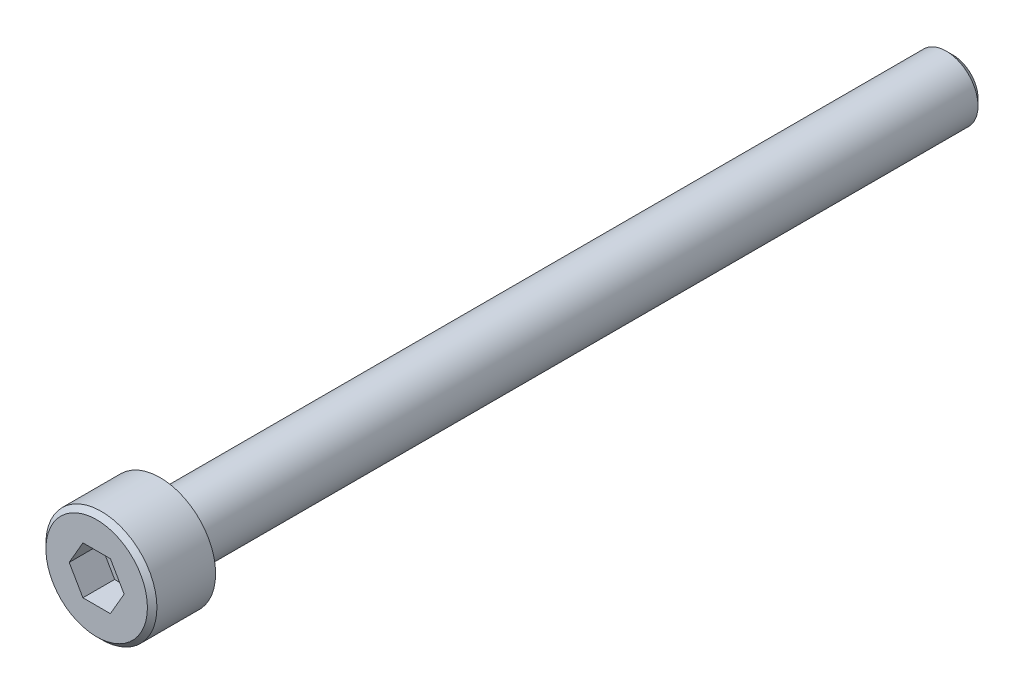
ISO-10303-21;
HEADER;
FILE_DESCRIPTION(('STEP AP214'),'2;1');
FILE_NAME('part.step','',(''),(''),'','','');
FILE_SCHEMA(('AUTOMOTIVE_DESIGN { 1 0 10303 214 1 1 1 1 }'));
ENDSEC;
DATA;
#1=APPLICATION_CONTEXT('core data for automotive mechanical design processes');
#2=APPLICATION_PROTOCOL_DEFINITION('international standard','automotive_design',2000,#1);
#3=PRODUCT_CONTEXT('',#1,'mechanical');
#4=PRODUCT('Part','Part','',(#3));
#5=PRODUCT_RELATED_PRODUCT_CATEGORY('part','',(#4));
#6=PRODUCT_DEFINITION_FORMATION('','',#4);
#7=PRODUCT_DEFINITION_CONTEXT('part definition',#1,'design');
#8=PRODUCT_DEFINITION('design','',#6,#7);
#9=PRODUCT_DEFINITION_SHAPE('','',#8);
#10=(LENGTH_UNIT() NAMED_UNIT(*) SI_UNIT(.MILLI.,.METRE.));
#11=(NAMED_UNIT(*) PLANE_ANGLE_UNIT() SI_UNIT($,.RADIAN.));
#12=(NAMED_UNIT(*) SI_UNIT($,.STERADIAN.) SOLID_ANGLE_UNIT());
#13=UNCERTAINTY_MEASURE_WITH_UNIT(LENGTH_MEASURE(1.E-05),#10,'distance_accuracy_value','');
#14=(GEOMETRIC_REPRESENTATION_CONTEXT(3) GLOBAL_UNCERTAINTY_ASSIGNED_CONTEXT((#13)) GLOBAL_UNIT_ASSIGNED_CONTEXT((#10,
#11,#12)) REPRESENTATION_CONTEXT('',''));
#15=CARTESIAN_POINT('',(0.,0.,0.));
#16=DIRECTION('',(0.,0.,1.));
#17=DIRECTION('',(1.,0.,0.));
#18=AXIS2_PLACEMENT_3D('',#15,#16,#17);
#19=CARTESIAN_POINT('',(0.,0.,4.));
#20=DIRECTION('',(0.,0.,-1.));
#21=DIRECTION('',(-1.,0.,0.));
#22=AXIS2_PLACEMENT_3D('',#19,#20,#21);
#23=PLANE('',#22);
#24=DIRECTION('',(1.,0.,0.));
#25=VECTOR('',#24,1.);
#26=CARTESIAN_POINT('',(-0.866025403784439,-1.5,4.));
#27=LINE('',#26,#25);
#28=CARTESIAN_POINT('',(-0.866025403784439,-1.5,4.));
#29=VERTEX_POINT('',#28);
#30=CARTESIAN_POINT('',(0.866025403784439,-1.5,4.));
#31=VERTEX_POINT('',#30);
#32=EDGE_CURVE('E125',#29,#31,#27,.T.);
#33=ORIENTED_EDGE('',*,*,#32,.F.);
#34=DIRECTION('',(0.5,-0.866025403784439,0.));
#35=VECTOR('',#34,1.);
#36=CARTESIAN_POINT('',(-1.73205080756888,0.,4.));
#37=LINE('',#36,#35);
#38=CARTESIAN_POINT('',(-1.73205080756888,0.,4.));
#39=VERTEX_POINT('',#38);
#40=EDGE_CURVE('E51',#39,#29,#37,.T.);
#41=ORIENTED_EDGE('',*,*,#40,.F.);
#42=DIRECTION('',(-0.5,-0.866025403784439,0.));
#43=VECTOR('',#42,1.);
#44=CARTESIAN_POINT('',(-0.866025403784439,1.5,4.));
#45=LINE('',#44,#43);
#46=CARTESIAN_POINT('',(-0.866025403784439,1.5,4.));
#47=VERTEX_POINT('',#46);
#48=EDGE_CURVE('E134',#47,#39,#45,.T.);
#49=ORIENTED_EDGE('',*,*,#48,.F.);
#50=DIRECTION('',(-1.,0.,0.));
#51=VECTOR('',#50,1.);
#52=CARTESIAN_POINT('',(0.866025403784439,1.5,4.));
#53=LINE('',#52,#51);
#54=CARTESIAN_POINT('',(0.866025403784439,1.5,4.));
#55=VERTEX_POINT('',#54);
#56=EDGE_CURVE('E132',#55,#47,#53,.T.);
#57=ORIENTED_EDGE('',*,*,#56,.F.);
#58=DIRECTION('',(-0.5,0.866025403784439,0.));
#59=VECTOR('',#58,1.);
#60=CARTESIAN_POINT('',(1.73205080756888,0.,4.));
#61=LINE('',#60,#59);
#62=CARTESIAN_POINT('',(1.73205080756888,0.,4.));
#63=VERTEX_POINT('',#62);
#64=EDGE_CURVE('E99',#63,#55,#61,.T.);
#65=ORIENTED_EDGE('',*,*,#64,.F.);
#66=DIRECTION('',(0.5,0.866025403784439,0.));
#67=VECTOR('',#66,1.);
#68=CARTESIAN_POINT('',(0.866025403784439,-1.5,4.));
#69=LINE('',#68,#67);
#70=EDGE_CURVE('E128',#31,#63,#69,.T.);
#71=ORIENTED_EDGE('',*,*,#70,.F.);
#72=EDGE_LOOP('',(#33,#41,#49,#57,#65,#71));
#73=FACE_BOUND('',#72,.T.);
#74=CARTESIAN_POINT('',(0.,0.,4.));
#75=DIRECTION('',(0.,0.,1.));
#76=DIRECTION('',(1.,0.,0.));
#77=AXIS2_PLACEMENT_3D('',#74,#75,#76);
#78=CIRCLE('',#77,3.2);
#79=CARTESIAN_POINT('',(3.2,0.,4.));
#80=VERTEX_POINT('',#79);
#81=EDGE_CURVE('E11',#80,#80,#78,.T.);
#82=ORIENTED_EDGE('',*,*,#81,.T.);
#83=EDGE_LOOP('',(#82));
#84=FACE_BOUND('',#83,.T.);
#85=ADVANCED_FACE('F37',(#73,#84),#23,.F.);
#86=CARTESIAN_POINT('',(0.,0.,3.7));
#87=DIRECTION('',(0.,0.,-1.));
#88=DIRECTION('',(-1.,0.,0.));
#89=AXIS2_PLACEMENT_3D('',#86,#87,#88);
#90=CONICAL_SURFACE('',#89,3.5,0.785398163397445);
#91=ORIENTED_EDGE('',*,*,#81,.F.);
#92=EDGE_LOOP('',(#91));
#93=FACE_BOUND('',#92,.T.);
#94=CARTESIAN_POINT('',(0.,0.,3.7));
#95=DIRECTION('',(0.,0.,1.));
#96=DIRECTION('',(1.,0.,0.));
#97=AXIS2_PLACEMENT_3D('',#94,#95,#96);
#98=CIRCLE('',#97,3.5);
#99=CARTESIAN_POINT('',(3.5,0.,3.7));
#100=VERTEX_POINT('',#99);
#101=EDGE_CURVE('E44',#100,#100,#98,.T.);
#102=ORIENTED_EDGE('',*,*,#101,.T.);
#103=EDGE_LOOP('',(#102));
#104=FACE_BOUND('',#103,.T.);
#105=ADVANCED_FACE('F157',(#93,#104),#90,.T.);
#106=CARTESIAN_POINT('',(0.,0.,-50.));
#107=DIRECTION('',(0.,0.,1.));
#108=DIRECTION('',(1.,0.,0.));
#109=AXIS2_PLACEMENT_3D('',#106,#107,#108);
#110=CYLINDRICAL_SURFACE('',#109,3.5);
#111=ORIENTED_EDGE('',*,*,#101,.F.);
#112=EDGE_LOOP('',(#111));
#113=FACE_BOUND('',#112,.T.);
#114=CARTESIAN_POINT('',(0.,0.,0.));
#115=DIRECTION('',(0.,0.,1.));
#116=DIRECTION('',(1.,0.,0.));
#117=AXIS2_PLACEMENT_3D('',#114,#115,#116);
#118=CIRCLE('',#117,3.5);
#119=CARTESIAN_POINT('',(3.5,0.,0.));
#120=VERTEX_POINT('',#119);
#121=EDGE_CURVE('E152',#120,#120,#118,.T.);
#122=ORIENTED_EDGE('',*,*,#121,.T.);
#123=EDGE_LOOP('',(#122));
#124=FACE_BOUND('',#123,.T.);
#125=ADVANCED_FACE('F159',(#113,#124),#110,.T.);
#126=CARTESIAN_POINT('',(0.,3.5,0.));
#127=DIRECTION('',(0.,0.,1.));
#128=DIRECTION('',(1.,0.,0.));
#129=AXIS2_PLACEMENT_3D('',#126,#127,#128);
#130=PLANE('',#129);
#131=ORIENTED_EDGE('',*,*,#121,.F.);
#132=EDGE_LOOP('',(#131));
#133=FACE_BOUND('',#132,.T.);
#134=CARTESIAN_POINT('',(0.,0.,0.));
#135=DIRECTION('',(0.,0.,1.));
#136=DIRECTION('',(1.,0.,0.));
#137=AXIS2_PLACEMENT_3D('',#134,#135,#136);
#138=CIRCLE('',#137,2.);
#139=CARTESIAN_POINT('',(2.,0.,0.));
#140=VERTEX_POINT('',#139);
#141=EDGE_CURVE('E149',#140,#140,#138,.T.);
#142=ORIENTED_EDGE('',*,*,#141,.T.);
#143=EDGE_LOOP('',(#142));
#144=FACE_BOUND('',#143,.T.);
#145=ADVANCED_FACE('F162',(#133,#144),#130,.F.);
#146=CARTESIAN_POINT('',(0.,0.,-50.));
#147=DIRECTION('',(0.,0.,1.));
#148=DIRECTION('',(1.,0.,0.));
#149=AXIS2_PLACEMENT_3D('',#146,#147,#148);
#150=CYLINDRICAL_SURFACE('',#149,2.);
#151=ORIENTED_EDGE('',*,*,#141,.F.);
#152=EDGE_LOOP('',(#151));
#153=FACE_BOUND('',#152,.T.);
#154=CARTESIAN_POINT('',(0.,0.,-49.5705));
#155=DIRECTION('',(0.,0.,1.));
#156=DIRECTION('',(1.,0.,0.));
#157=AXIS2_PLACEMENT_3D('',#154,#155,#156);
#158=CIRCLE('',#157,2.);
#159=CARTESIAN_POINT('',(2.,0.,-49.5705));
#160=VERTEX_POINT('',#159);
#161=EDGE_CURVE('E146',#160,#160,#158,.T.);
#162=ORIENTED_EDGE('',*,*,#161,.T.);
#163=EDGE_LOOP('',(#162));
#164=FACE_BOUND('',#163,.T.);
#165=ADVANCED_FACE('F168',(#153,#164),#150,.T.);
#166=CARTESIAN_POINT('',(0.,0.,-50.));
#167=DIRECTION('',(0.,0.,1.));
#168=DIRECTION('',(1.,0.,0.));
#169=AXIS2_PLACEMENT_3D('',#166,#167,#168);
#170=CONICAL_SURFACE('',#169,1.5705,0.785398163397449);
#171=ORIENTED_EDGE('',*,*,#161,.F.);
#172=EDGE_LOOP('',(#171));
#173=FACE_BOUND('',#172,.T.);
#174=CARTESIAN_POINT('',(0.,0.,-50.));
#175=DIRECTION('',(0.,0.,1.));
#176=DIRECTION('',(1.,0.,0.));
#177=AXIS2_PLACEMENT_3D('',#174,#175,#176);
#178=CIRCLE('',#177,1.5705);
#179=CARTESIAN_POINT('',(1.5705,0.,-50.));
#180=VERTEX_POINT('',#179);
#181=EDGE_CURVE('E138',#180,#180,#178,.T.);
#182=ORIENTED_EDGE('',*,*,#181,.T.);
#183=EDGE_LOOP('',(#182));
#184=FACE_BOUND('',#183,.T.);
#185=ADVANCED_FACE('F174',(#173,#184),#170,.T.);
#186=CARTESIAN_POINT('',(0.,1.5705,-50.));
#187=DIRECTION('',(0.,0.,1.));
#188=DIRECTION('',(1.,0.,0.));
#189=AXIS2_PLACEMENT_3D('',#186,#187,#188);
#190=PLANE('',#189);
#191=ORIENTED_EDGE('',*,*,#181,.F.);
#192=EDGE_LOOP('',(#191));
#193=FACE_BOUND('',#192,.T.);
#194=ADVANCED_FACE('F180',(#193),#190,.F.);
#195=CARTESIAN_POINT('',(-1.73205080756888,0.,2.));
#196=DIRECTION('',(-0.866025403784439,-0.5,0.));
#197=DIRECTION('',(0.5,-0.866025403784439,0.));
#198=AXIS2_PLACEMENT_3D('',#195,#196,#197);
#199=PLANE('',#198);
#200=ORIENTED_EDGE('',*,*,#40,.T.);
#201=DIRECTION('',(0.,0.,1.));
#202=VECTOR('',#201,1.);
#203=CARTESIAN_POINT('',(-0.866025403784439,-1.5,2.));
#204=LINE('',#203,#202);
#205=CARTESIAN_POINT('',(-0.866025403784439,-1.5,2.));
#206=VERTEX_POINT('',#205);
#207=EDGE_CURVE('E81',#206,#29,#204,.T.);
#208=ORIENTED_EDGE('',*,*,#207,.F.);
#209=DIRECTION('',(0.5,-0.866025403784439,0.));
#210=VECTOR('',#209,1.);
#211=CARTESIAN_POINT('',(-1.73205080756888,0.,2.));
#212=LINE('',#211,#210);
#213=CARTESIAN_POINT('',(-1.73205080756888,0.,2.));
#214=VERTEX_POINT('',#213);
#215=EDGE_CURVE('E136',#214,#206,#212,.T.);
#216=ORIENTED_EDGE('',*,*,#215,.F.);
#217=DIRECTION('',(0.,0.,1.));
#218=VECTOR('',#217,1.);
#219=CARTESIAN_POINT('',(-1.73205080756888,0.,2.));
#220=LINE('',#219,#218);
#221=EDGE_CURVE('E59',#214,#39,#220,.T.);
#222=ORIENTED_EDGE('',*,*,#221,.T.);
#223=EDGE_LOOP('',(#200,#208,#216,#222));
#224=FACE_BOUND('',#223,.T.);
#225=ADVANCED_FACE('F185',(#224),#199,.F.);
#226=CARTESIAN_POINT('',(-0.866025403784439,1.5,2.));
#227=DIRECTION('',(-0.866025403784439,0.5,0.));
#228=DIRECTION('',(-0.5,-0.866025403784439,0.));
#229=AXIS2_PLACEMENT_3D('',#226,#227,#228);
#230=PLANE('',#229);
#231=ORIENTED_EDGE('',*,*,#48,.T.);
#232=ORIENTED_EDGE('',*,*,#221,.F.);
#233=DIRECTION('',(-0.5,-0.866025403784439,0.));
#234=VECTOR('',#233,1.);
#235=CARTESIAN_POINT('',(-0.866025403784439,1.5,2.));
#236=LINE('',#235,#234);
#237=CARTESIAN_POINT('',(-0.866025403784439,1.5,2.));
#238=VERTEX_POINT('',#237);
#239=EDGE_CURVE('E111',#238,#214,#236,.T.);
#240=ORIENTED_EDGE('',*,*,#239,.F.);
#241=DIRECTION('',(0.,0.,1.));
#242=VECTOR('',#241,1.);
#243=CARTESIAN_POINT('',(-0.866025403784439,1.5,2.));
#244=LINE('',#243,#242);
#245=EDGE_CURVE('E103',#238,#47,#244,.T.);
#246=ORIENTED_EDGE('',*,*,#245,.T.);
#247=EDGE_LOOP('',(#231,#232,#240,#246));
#248=FACE_BOUND('',#247,.T.);
#249=ADVANCED_FACE('F190',(#248),#230,.F.);
#250=CARTESIAN_POINT('',(0.866025403784439,1.5,2.));
#251=DIRECTION('',(0.,1.,0.));
#252=DIRECTION('',(0.,0.,1.));
#253=AXIS2_PLACEMENT_3D('',#250,#251,#252);
#254=PLANE('',#253);
#255=ORIENTED_EDGE('',*,*,#56,.T.);
#256=ORIENTED_EDGE('',*,*,#245,.F.);
#257=DIRECTION('',(-1.,0.,0.));
#258=VECTOR('',#257,1.);
#259=CARTESIAN_POINT('',(0.866025403784439,1.5,2.));
#260=LINE('',#259,#258);
#261=CARTESIAN_POINT('',(0.866025403784439,1.5,2.));
#262=VERTEX_POINT('',#261);
#263=EDGE_CURVE('E107',#262,#238,#260,.T.);
#264=ORIENTED_EDGE('',*,*,#263,.F.);
#265=DIRECTION('',(0.,0.,1.));
#266=VECTOR('',#265,1.);
#267=CARTESIAN_POINT('',(0.866025403784439,1.5,2.));
#268=LINE('',#267,#266);
#269=EDGE_CURVE('E92',#262,#55,#268,.T.);
#270=ORIENTED_EDGE('',*,*,#269,.T.);
#271=EDGE_LOOP('',(#255,#256,#264,#270));
#272=FACE_BOUND('',#271,.T.);
#273=ADVANCED_FACE('F108',(#272),#254,.F.);
#274=CARTESIAN_POINT('',(1.73205080756888,0.,2.));
#275=DIRECTION('',(0.866025403784439,0.5,0.));
#276=DIRECTION('',(-0.5,0.866025403784439,0.));
#277=AXIS2_PLACEMENT_3D('',#274,#275,#276);
#278=PLANE('',#277);
#279=ORIENTED_EDGE('',*,*,#64,.T.);
#280=ORIENTED_EDGE('',*,*,#269,.F.);
#281=DIRECTION('',(-0.5,0.866025403784439,0.));
#282=VECTOR('',#281,1.);
#283=CARTESIAN_POINT('',(1.73205080756888,0.,2.));
#284=LINE('',#283,#282);
#285=CARTESIAN_POINT('',(1.73205080756888,0.,2.));
#286=VERTEX_POINT('',#285);
#287=EDGE_CURVE('E96',#286,#262,#284,.T.);
#288=ORIENTED_EDGE('',*,*,#287,.F.);
#289=DIRECTION('',(0.,0.,1.));
#290=VECTOR('',#289,1.);
#291=CARTESIAN_POINT('',(1.73205080756888,0.,2.));
#292=LINE('',#291,#290);
#293=EDGE_CURVE('E104',#286,#63,#292,.T.);
#294=ORIENTED_EDGE('',*,*,#293,.T.);
#295=EDGE_LOOP('',(#279,#280,#288,#294));
#296=FACE_BOUND('',#295,.T.);
#297=ADVANCED_FACE('F94',(#296),#278,.F.);
#298=CARTESIAN_POINT('',(0.866025403784439,-1.5,2.));
#299=DIRECTION('',(0.866025403784439,-0.5,0.));
#300=DIRECTION('',(0.5,0.866025403784439,0.));
#301=AXIS2_PLACEMENT_3D('',#298,#299,#300);
#302=PLANE('',#301);
#303=ORIENTED_EDGE('',*,*,#70,.T.);
#304=ORIENTED_EDGE('',*,*,#293,.F.);
#305=DIRECTION('',(0.5,0.866025403784439,0.));
#306=VECTOR('',#305,1.);
#307=CARTESIAN_POINT('',(0.866025403784439,-1.5,2.));
#308=LINE('',#307,#306);
#309=CARTESIAN_POINT('',(0.866025403784439,-1.5,2.));
#310=VERTEX_POINT('',#309);
#311=EDGE_CURVE('E117',#310,#286,#308,.T.);
#312=ORIENTED_EDGE('',*,*,#311,.F.);
#313=DIRECTION('',(0.,0.,1.));
#314=VECTOR('',#313,1.);
#315=CARTESIAN_POINT('',(0.866025403784439,-1.5,2.));
#316=LINE('',#315,#314);
#317=EDGE_CURVE('E141',#310,#31,#316,.T.);
#318=ORIENTED_EDGE('',*,*,#317,.T.);
#319=EDGE_LOOP('',(#303,#304,#312,#318));
#320=FACE_BOUND('',#319,.T.);
#321=ADVANCED_FACE('F216',(#320),#302,.F.);
#322=CARTESIAN_POINT('',(-0.866025403784439,-1.5,2.));
#323=DIRECTION('',(0.,-1.,0.));
#324=DIRECTION('',(0.,0.,-1.));
#325=AXIS2_PLACEMENT_3D('',#322,#323,#324);
#326=PLANE('',#325);
#327=ORIENTED_EDGE('',*,*,#32,.T.);
#328=ORIENTED_EDGE('',*,*,#317,.F.);
#329=DIRECTION('',(1.,0.,0.));
#330=VECTOR('',#329,1.);
#331=CARTESIAN_POINT('',(-0.866025403784439,-1.5,2.));
#332=LINE('',#331,#330);
#333=EDGE_CURVE('E119',#206,#310,#332,.T.);
#334=ORIENTED_EDGE('',*,*,#333,.F.);
#335=ORIENTED_EDGE('',*,*,#207,.T.);
#336=EDGE_LOOP('',(#327,#328,#334,#335));
#337=FACE_BOUND('',#336,.T.);
#338=ADVANCED_FACE('F204',(#337),#326,.F.);
#339=CARTESIAN_POINT('',(0.,0.,2.));
#340=DIRECTION('',(0.,0.,1.));
#341=DIRECTION('',(1.,0.,0.));
#342=AXIS2_PLACEMENT_3D('',#339,#340,#341);
#343=PLANE('',#342);
#344=ORIENTED_EDGE('',*,*,#215,.T.);
#345=ORIENTED_EDGE('',*,*,#333,.T.);
#346=ORIENTED_EDGE('',*,*,#311,.T.);
#347=ORIENTED_EDGE('',*,*,#287,.T.);
#348=ORIENTED_EDGE('',*,*,#263,.T.);
#349=ORIENTED_EDGE('',*,*,#239,.T.);
#350=EDGE_LOOP('',(#344,#345,#346,#347,#348,#349));
#351=FACE_BOUND('',#350,.T.);
#352=ADVANCED_FACE('F114',(#351),#343,.T.);
#353=CLOSED_SHELL('',(#85,#105,#125,#145,#165,#185,#194,#225,#249,#273,#297,#321,#338,#352));
#354=MANIFOLD_SOLID_BREP('B2',#353);
#355=ADVANCED_BREP_SHAPE_REPRESENTATION('',(#18,#354),#14);
#356=SHAPE_DEFINITION_REPRESENTATION(#9,#355);
ENDSEC;
END-ISO-10303-21;
